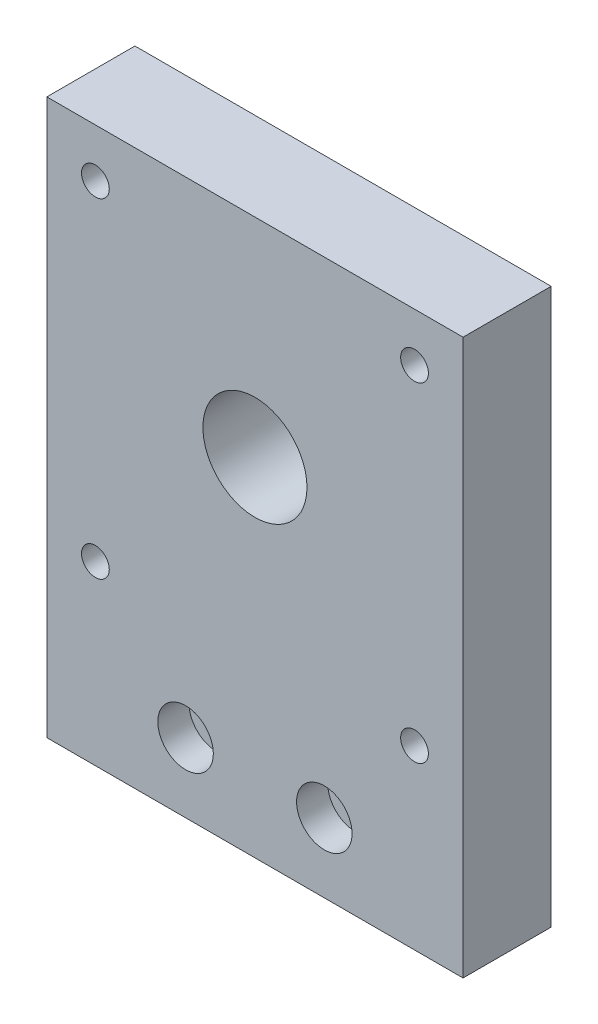
ISO-10303-21;
HEADER;
FILE_DESCRIPTION(('STEP AP214'),'2;1');
FILE_NAME('part.step','',(''),(''),'','','');
FILE_SCHEMA(('AUTOMOTIVE_DESIGN { 1 0 10303 214 1 1 1 1 }'));
ENDSEC;
DATA;
#1=APPLICATION_CONTEXT('core data for automotive mechanical design processes');
#2=APPLICATION_PROTOCOL_DEFINITION('international standard','automotive_design',2000,#1);
#3=PRODUCT_CONTEXT('',#1,'mechanical');
#4=PRODUCT('Part','Part','',(#3));
#5=PRODUCT_RELATED_PRODUCT_CATEGORY('part','',(#4));
#6=PRODUCT_DEFINITION_FORMATION('','',#4);
#7=PRODUCT_DEFINITION_CONTEXT('part definition',#1,'design');
#8=PRODUCT_DEFINITION('design','',#6,#7);
#9=PRODUCT_DEFINITION_SHAPE('','',#8);
#10=(LENGTH_UNIT() NAMED_UNIT(*) SI_UNIT(.MILLI.,.METRE.));
#11=(NAMED_UNIT(*) PLANE_ANGLE_UNIT() SI_UNIT($,.RADIAN.));
#12=(NAMED_UNIT(*) SI_UNIT($,.STERADIAN.) SOLID_ANGLE_UNIT());
#13=UNCERTAINTY_MEASURE_WITH_UNIT(LENGTH_MEASURE(1.E-05),#10,'distance_accuracy_value','');
#14=(GEOMETRIC_REPRESENTATION_CONTEXT(3) GLOBAL_UNCERTAINTY_ASSIGNED_CONTEXT((#13)) GLOBAL_UNIT_ASSIGNED_CONTEXT((#10,
#11,#12)) REPRESENTATION_CONTEXT('',''));
#15=CARTESIAN_POINT('',(0.,0.,0.));
#16=DIRECTION('',(0.,0.,1.));
#17=DIRECTION('',(1.,0.,0.));
#18=AXIS2_PLACEMENT_3D('',#15,#16,#17);
#19=CARTESIAN_POINT('',(10.,-30.,12.7));
#20=DIRECTION('',(0.,0.,-1.));
#21=DIRECTION('',(-1.,0.,0.));
#22=AXIS2_PLACEMENT_3D('',#19,#20,#21);
#23=CYLINDRICAL_SURFACE('',#22,2.);
#24=CARTESIAN_POINT('',(10.,-30.,0.));
#25=DIRECTION('',(0.,0.,1.));
#26=DIRECTION('',(1.,0.,0.));
#27=AXIS2_PLACEMENT_3D('',#24,#25,#26);
#28=CIRCLE('',#27,2.);
#29=CARTESIAN_POINT('',(12.,-30.,0.));
#30=VERTEX_POINT('',#29);
#31=EDGE_CURVE('E139',#30,#30,#28,.T.);
#32=ORIENTED_EDGE('',*,*,#31,.F.);
#33=EDGE_LOOP('',(#32));
#34=FACE_BOUND('',#33,.T.);
#35=CARTESIAN_POINT('',(10.,-30.,8.2));
#36=DIRECTION('',(0.,0.,1.));
#37=DIRECTION('',(1.,0.,0.));
#38=AXIS2_PLACEMENT_3D('',#35,#36,#37);
#39=CIRCLE('',#38,2.);
#40=CARTESIAN_POINT('',(12.,-30.,8.2));
#41=VERTEX_POINT('',#40);
#42=EDGE_CURVE('E39',#41,#41,#39,.T.);
#43=ORIENTED_EDGE('',*,*,#42,.T.);
#44=EDGE_LOOP('',(#43));
#45=FACE_BOUND('',#44,.T.);
#46=ADVANCED_FACE('F35',(#34,#45),#23,.F.);
#47=CARTESIAN_POINT('',(-9.99999999999999,-30.,12.7));
#48=DIRECTION('',(0.,0.,-1.));
#49=DIRECTION('',(-1.,0.,0.));
#50=AXIS2_PLACEMENT_3D('',#47,#48,#49);
#51=CYLINDRICAL_SURFACE('',#50,2.);
#52=CARTESIAN_POINT('',(-9.99999999999999,-30.,0.));
#53=DIRECTION('',(0.,0.,1.));
#54=DIRECTION('',(1.,0.,0.));
#55=AXIS2_PLACEMENT_3D('',#52,#53,#54);
#56=CIRCLE('',#55,2.);
#57=CARTESIAN_POINT('',(-7.99999999999999,-30.,0.));
#58=VERTEX_POINT('',#57);
#59=EDGE_CURVE('E136',#58,#58,#56,.T.);
#60=ORIENTED_EDGE('',*,*,#59,.F.);
#61=EDGE_LOOP('',(#60));
#62=FACE_BOUND('',#61,.T.);
#63=CARTESIAN_POINT('',(-9.99999999999999,-30.,8.2));
#64=DIRECTION('',(0.,0.,1.));
#65=DIRECTION('',(1.,0.,0.));
#66=AXIS2_PLACEMENT_3D('',#63,#64,#65);
#67=CIRCLE('',#66,2.);
#68=CARTESIAN_POINT('',(-7.99999999999999,-30.,8.2));
#69=VERTEX_POINT('',#68);
#70=EDGE_CURVE('E122',#69,#69,#67,.T.);
#71=ORIENTED_EDGE('',*,*,#70,.T.);
#72=EDGE_LOOP('',(#71));
#73=FACE_BOUND('',#72,.T.);
#74=ADVANCED_FACE('F181',(#62,#73),#51,.F.);
#75=CARTESIAN_POINT('',(0.,-40.,12.7));
#76=DIRECTION('',(0.,-1.,0.));
#77=DIRECTION('',(0.,0.,-1.));
#78=AXIS2_PLACEMENT_3D('',#75,#76,#77);
#79=PLANE('',#78);
#80=DIRECTION('',(-1.,0.,0.));
#81=VECTOR('',#80,1.);
#82=CARTESIAN_POINT('',(0.,-40.,0.));
#83=LINE('',#82,#81);
#84=CARTESIAN_POINT('',(30.,-40.,0.));
#85=VERTEX_POINT('',#84);
#86=CARTESIAN_POINT('',(-30.,-40.,0.));
#87=VERTEX_POINT('',#86);
#88=EDGE_CURVE('E119',#85,#87,#83,.T.);
#89=ORIENTED_EDGE('',*,*,#88,.F.);
#90=DIRECTION('',(0.,0.,-1.));
#91=VECTOR('',#90,1.);
#92=CARTESIAN_POINT('',(30.,-40.,12.7));
#93=LINE('',#92,#91);
#94=CARTESIAN_POINT('',(30.,-40.,12.7));
#95=VERTEX_POINT('',#94);
#96=EDGE_CURVE('E11',#95,#85,#93,.T.);
#97=ORIENTED_EDGE('',*,*,#96,.F.);
#98=DIRECTION('',(-1.,0.,0.));
#99=VECTOR('',#98,1.);
#100=CARTESIAN_POINT('',(0.,-40.,12.7));
#101=LINE('',#100,#99);
#102=CARTESIAN_POINT('',(-30.,-40.,12.7));
#103=VERTEX_POINT('',#102);
#104=EDGE_CURVE('E97',#95,#103,#101,.T.);
#105=ORIENTED_EDGE('',*,*,#104,.T.);
#106=DIRECTION('',(0.,0.,-1.));
#107=VECTOR('',#106,1.);
#108=CARTESIAN_POINT('',(-30.,-40.,12.7));
#109=LINE('',#108,#107);
#110=EDGE_CURVE('E76',#103,#87,#109,.T.);
#111=ORIENTED_EDGE('',*,*,#110,.T.);
#112=EDGE_LOOP('',(#89,#97,#105,#111));
#113=FACE_BOUND('',#112,.T.);
#114=ADVANCED_FACE('F37',(#113),#79,.T.);
#115=CARTESIAN_POINT('',(30.,0.,12.7));
#116=DIRECTION('',(1.,0.,0.));
#117=DIRECTION('',(0.,1.,0.));
#118=AXIS2_PLACEMENT_3D('',#115,#116,#117);
#119=PLANE('',#118);
#120=DIRECTION('',(0.,-1.,0.));
#121=VECTOR('',#120,1.);
#122=CARTESIAN_POINT('',(30.,0.,0.));
#123=LINE('',#122,#121);
#124=CARTESIAN_POINT('',(30.,40.,0.));
#125=VERTEX_POINT('',#124);
#126=EDGE_CURVE('E89',#125,#85,#123,.T.);
#127=ORIENTED_EDGE('',*,*,#126,.F.);
#128=DIRECTION('',(0.,0.,-1.));
#129=VECTOR('',#128,1.);
#130=CARTESIAN_POINT('',(30.,40.,12.7));
#131=LINE('',#130,#129);
#132=CARTESIAN_POINT('',(30.,40.,12.7));
#133=VERTEX_POINT('',#132);
#134=EDGE_CURVE('E45',#133,#125,#131,.T.);
#135=ORIENTED_EDGE('',*,*,#134,.F.);
#136=DIRECTION('',(0.,-1.,0.));
#137=VECTOR('',#136,1.);
#138=CARTESIAN_POINT('',(30.,0.,12.7));
#139=LINE('',#138,#137);
#140=EDGE_CURVE('E87',#133,#95,#139,.T.);
#141=ORIENTED_EDGE('',*,*,#140,.T.);
#142=ORIENTED_EDGE('',*,*,#96,.T.);
#143=EDGE_LOOP('',(#127,#135,#141,#142));
#144=FACE_BOUND('',#143,.T.);
#145=ADVANCED_FACE('F85',(#144),#119,.T.);
#146=CARTESIAN_POINT('',(0.,40.,12.7));
#147=DIRECTION('',(0.,-1.,0.));
#148=DIRECTION('',(0.,0.,-1.));
#149=AXIS2_PLACEMENT_3D('',#146,#147,#148);
#150=PLANE('',#149);
#151=DIRECTION('',(-1.,0.,0.));
#152=VECTOR('',#151,1.);
#153=CARTESIAN_POINT('',(0.,40.,0.));
#154=LINE('',#153,#152);
#155=CARTESIAN_POINT('',(-30.,40.,0.));
#156=VERTEX_POINT('',#155);
#157=EDGE_CURVE('E69',#125,#156,#154,.T.);
#158=ORIENTED_EDGE('',*,*,#157,.T.);
#159=DIRECTION('',(0.,0.,-1.));
#160=VECTOR('',#159,1.);
#161=CARTESIAN_POINT('',(-30.,40.,12.7));
#162=LINE('',#161,#160);
#163=CARTESIAN_POINT('',(-30.,40.,12.7));
#164=VERTEX_POINT('',#163);
#165=EDGE_CURVE('E90',#164,#156,#162,.T.);
#166=ORIENTED_EDGE('',*,*,#165,.F.);
#167=DIRECTION('',(-1.,0.,0.));
#168=VECTOR('',#167,1.);
#169=CARTESIAN_POINT('',(0.,40.,12.7));
#170=LINE('',#169,#168);
#171=EDGE_CURVE('E92',#133,#164,#170,.T.);
#172=ORIENTED_EDGE('',*,*,#171,.F.);
#173=ORIENTED_EDGE('',*,*,#134,.T.);
#174=EDGE_LOOP('',(#158,#166,#172,#173));
#175=FACE_BOUND('',#174,.T.);
#176=ADVANCED_FACE('F93',(#175),#150,.F.);
#177=CARTESIAN_POINT('',(0.,10.,12.7));
#178=DIRECTION('',(0.,0.,-1.));
#179=DIRECTION('',(-1.,0.,0.));
#180=AXIS2_PLACEMENT_3D('',#177,#178,#179);
#181=CYLINDRICAL_SURFACE('',#180,7.5);
#182=CARTESIAN_POINT('',(0.,10.,12.7));
#183=DIRECTION('',(0.,0.,1.));
#184=DIRECTION('',(1.,0.,0.));
#185=AXIS2_PLACEMENT_3D('',#182,#183,#184);
#186=CIRCLE('',#185,7.5);
#187=CARTESIAN_POINT('',(7.5,10.,12.7));
#188=VERTEX_POINT('',#187);
#189=EDGE_CURVE('E113',#188,#188,#186,.T.);
#190=ORIENTED_EDGE('',*,*,#189,.T.);
#191=EDGE_LOOP('',(#190));
#192=FACE_BOUND('',#191,.T.);
#193=CARTESIAN_POINT('',(0.,10.,0.));
#194=DIRECTION('',(0.,0.,1.));
#195=DIRECTION('',(1.,0.,0.));
#196=AXIS2_PLACEMENT_3D('',#193,#194,#195);
#197=CIRCLE('',#196,7.5);
#198=CARTESIAN_POINT('',(7.5,10.,0.));
#199=VERTEX_POINT('',#198);
#200=EDGE_CURVE('E142',#199,#199,#197,.T.);
#201=ORIENTED_EDGE('',*,*,#200,.F.);
#202=EDGE_LOOP('',(#201));
#203=FACE_BOUND('',#202,.T.);
#204=ADVANCED_FACE('F191',(#192,#203),#181,.F.);
#205=CARTESIAN_POINT('',(-23.,33.,12.7));
#206=DIRECTION('',(0.,0.,-1.));
#207=DIRECTION('',(-1.,0.,0.));
#208=AXIS2_PLACEMENT_3D('',#205,#206,#207);
#209=CYLINDRICAL_SURFACE('',#208,2.);
#210=CARTESIAN_POINT('',(-23.,33.,12.7));
#211=DIRECTION('',(0.,0.,1.));
#212=DIRECTION('',(1.,0.,0.));
#213=AXIS2_PLACEMENT_3D('',#210,#211,#212);
#214=CIRCLE('',#213,2.);
#215=CARTESIAN_POINT('',(-21.,33.,12.7));
#216=VERTEX_POINT('',#215);
#217=EDGE_CURVE('E110',#216,#216,#214,.T.);
#218=ORIENTED_EDGE('',*,*,#217,.T.);
#219=EDGE_LOOP('',(#218));
#220=FACE_BOUND('',#219,.T.);
#221=CARTESIAN_POINT('',(-23.,33.,0.));
#222=DIRECTION('',(0.,0.,1.));
#223=DIRECTION('',(1.,0.,0.));
#224=AXIS2_PLACEMENT_3D('',#221,#222,#223);
#225=CIRCLE('',#224,2.);
#226=CARTESIAN_POINT('',(-21.,33.,0.));
#227=VERTEX_POINT('',#226);
#228=EDGE_CURVE('E133',#227,#227,#225,.T.);
#229=ORIENTED_EDGE('',*,*,#228,.F.);
#230=EDGE_LOOP('',(#229));
#231=FACE_BOUND('',#230,.T.);
#232=ADVANCED_FACE('F194',(#220,#231),#209,.F.);
#233=CARTESIAN_POINT('',(-23.,-14.5,12.7));
#234=DIRECTION('',(0.,0.,-1.));
#235=DIRECTION('',(-1.,0.,0.));
#236=AXIS2_PLACEMENT_3D('',#233,#234,#235);
#237=CYLINDRICAL_SURFACE('',#236,2.);
#238=CARTESIAN_POINT('',(-23.,-14.5,12.7));
#239=DIRECTION('',(0.,0.,1.));
#240=DIRECTION('',(1.,0.,0.));
#241=AXIS2_PLACEMENT_3D('',#238,#239,#240);
#242=CIRCLE('',#241,2.);
#243=CARTESIAN_POINT('',(-21.,-14.5,12.7));
#244=VERTEX_POINT('',#243);
#245=EDGE_CURVE('E107',#244,#244,#242,.T.);
#246=ORIENTED_EDGE('',*,*,#245,.T.);
#247=EDGE_LOOP('',(#246));
#248=FACE_BOUND('',#247,.T.);
#249=CARTESIAN_POINT('',(-23.,-14.5,0.));
#250=DIRECTION('',(0.,0.,1.));
#251=DIRECTION('',(1.,0.,0.));
#252=AXIS2_PLACEMENT_3D('',#249,#250,#251);
#253=CIRCLE('',#252,2.);
#254=CARTESIAN_POINT('',(-21.,-14.5,0.));
#255=VERTEX_POINT('',#254);
#256=EDGE_CURVE('E130',#255,#255,#253,.T.);
#257=ORIENTED_EDGE('',*,*,#256,.F.);
#258=EDGE_LOOP('',(#257));
#259=FACE_BOUND('',#258,.T.);
#260=ADVANCED_FACE('F197',(#248,#259),#237,.F.);
#261=CARTESIAN_POINT('',(23.,-14.5,12.7));
#262=DIRECTION('',(0.,0.,-1.));
#263=DIRECTION('',(-1.,0.,0.));
#264=AXIS2_PLACEMENT_3D('',#261,#262,#263);
#265=CYLINDRICAL_SURFACE('',#264,2.);
#266=CARTESIAN_POINT('',(23.,-14.5,12.7));
#267=DIRECTION('',(0.,0.,1.));
#268=DIRECTION('',(1.,0.,0.));
#269=AXIS2_PLACEMENT_3D('',#266,#267,#268);
#270=CIRCLE('',#269,2.);
#271=CARTESIAN_POINT('',(25.,-14.5,12.7));
#272=VERTEX_POINT('',#271);
#273=EDGE_CURVE('E104',#272,#272,#270,.F.);
#274=ORIENTED_EDGE('',*,*,#273,.F.);
#275=EDGE_LOOP('',(#274));
#276=FACE_BOUND('',#275,.T.);
#277=CARTESIAN_POINT('',(23.,-14.5,0.));
#278=DIRECTION('',(0.,0.,1.));
#279=DIRECTION('',(1.,0.,0.));
#280=AXIS2_PLACEMENT_3D('',#277,#278,#279);
#281=CIRCLE('',#280,2.);
#282=CARTESIAN_POINT('',(25.,-14.5,0.));
#283=VERTEX_POINT('',#282);
#284=EDGE_CURVE('E127',#283,#283,#281,.F.);
#285=ORIENTED_EDGE('',*,*,#284,.T.);
#286=EDGE_LOOP('',(#285));
#287=FACE_BOUND('',#286,.T.);
#288=ADVANCED_FACE('F201',(#276,#287),#265,.F.);
#289=CARTESIAN_POINT('',(-30.,0.,12.7));
#290=DIRECTION('',(1.,0.,0.));
#291=DIRECTION('',(0.,1.,0.));
#292=AXIS2_PLACEMENT_3D('',#289,#290,#291);
#293=PLANE('',#292);
#294=DIRECTION('',(0.,-1.,0.));
#295=VECTOR('',#294,1.);
#296=CARTESIAN_POINT('',(-30.,0.,0.));
#297=LINE('',#296,#295);
#298=EDGE_CURVE('E125',#156,#87,#297,.T.);
#299=ORIENTED_EDGE('',*,*,#298,.T.);
#300=ORIENTED_EDGE('',*,*,#110,.F.);
#301=DIRECTION('',(0.,-1.,0.));
#302=VECTOR('',#301,1.);
#303=CARTESIAN_POINT('',(-30.,0.,12.7));
#304=LINE('',#303,#302);
#305=EDGE_CURVE('E54',#164,#103,#304,.T.);
#306=ORIENTED_EDGE('',*,*,#305,.F.);
#307=ORIENTED_EDGE('',*,*,#165,.T.);
#308=EDGE_LOOP('',(#299,#300,#306,#307));
#309=FACE_BOUND('',#308,.T.);
#310=ADVANCED_FACE('F205',(#309),#293,.F.);
#311=CARTESIAN_POINT('',(23.,33.,12.7));
#312=DIRECTION('',(0.,0.,-1.));
#313=DIRECTION('',(-1.,0.,0.));
#314=AXIS2_PLACEMENT_3D('',#311,#312,#313);
#315=CYLINDRICAL_SURFACE('',#314,2.);
#316=CARTESIAN_POINT('',(23.,33.,12.7));
#317=DIRECTION('',(0.,0.,1.));
#318=DIRECTION('',(1.,0.,0.));
#319=AXIS2_PLACEMENT_3D('',#316,#317,#318);
#320=CIRCLE('',#319,2.);
#321=CARTESIAN_POINT('',(25.,33.,12.7));
#322=VERTEX_POINT('',#321);
#323=EDGE_CURVE('E116',#322,#322,#320,.F.);
#324=ORIENTED_EDGE('',*,*,#323,.F.);
#325=EDGE_LOOP('',(#324));
#326=FACE_BOUND('',#325,.T.);
#327=CARTESIAN_POINT('',(23.,33.,0.));
#328=DIRECTION('',(0.,0.,1.));
#329=DIRECTION('',(1.,0.,0.));
#330=AXIS2_PLACEMENT_3D('',#327,#328,#329);
#331=CIRCLE('',#330,2.);
#332=CARTESIAN_POINT('',(25.,33.,0.));
#333=VERTEX_POINT('',#332);
#334=EDGE_CURVE('E99',#333,#333,#331,.F.);
#335=ORIENTED_EDGE('',*,*,#334,.T.);
#336=EDGE_LOOP('',(#335));
#337=FACE_BOUND('',#336,.T.);
#338=ADVANCED_FACE('F209',(#326,#337),#315,.F.);
#339=CARTESIAN_POINT('',(0.,0.,12.7));
#340=DIRECTION('',(0.,0.,1.));
#341=DIRECTION('',(1.,0.,0.));
#342=AXIS2_PLACEMENT_3D('',#339,#340,#341);
#343=PLANE('',#342);
#344=CARTESIAN_POINT('',(10.,-30.,12.7));
#345=DIRECTION('',(0.,0.,1.));
#346=DIRECTION('',(1.,0.,0.));
#347=AXIS2_PLACEMENT_3D('',#344,#345,#346);
#348=CIRCLE('',#347,4.);
#349=CARTESIAN_POINT('',(14.,-30.,12.7));
#350=VERTEX_POINT('',#349);
#351=EDGE_CURVE('E159',#350,#350,#348,.T.);
#352=ORIENTED_EDGE('',*,*,#351,.F.);
#353=EDGE_LOOP('',(#352));
#354=FACE_BOUND('',#353,.T.);
#355=CARTESIAN_POINT('',(-9.99999999999999,-30.,12.7));
#356=DIRECTION('',(0.,0.,1.));
#357=DIRECTION('',(1.,0.,0.));
#358=AXIS2_PLACEMENT_3D('',#355,#356,#357);
#359=CIRCLE('',#358,4.);
#360=CARTESIAN_POINT('',(-5.99999999999999,-30.,12.7));
#361=VERTEX_POINT('',#360);
#362=EDGE_CURVE('E153',#361,#361,#359,.T.);
#363=ORIENTED_EDGE('',*,*,#362,.F.);
#364=EDGE_LOOP('',(#363));
#365=FACE_BOUND('',#364,.T.);
#366=ORIENTED_EDGE('',*,*,#104,.F.);
#367=ORIENTED_EDGE('',*,*,#140,.F.);
#368=ORIENTED_EDGE('',*,*,#171,.T.);
#369=ORIENTED_EDGE('',*,*,#305,.T.);
#370=EDGE_LOOP('',(#366,#367,#368,#369));
#371=FACE_BOUND('',#370,.T.);
#372=ORIENTED_EDGE('',*,*,#273,.T.);
#373=EDGE_LOOP('',(#372));
#374=FACE_BOUND('',#373,.T.);
#375=ORIENTED_EDGE('',*,*,#245,.F.);
#376=EDGE_LOOP('',(#375));
#377=FACE_BOUND('',#376,.T.);
#378=ORIENTED_EDGE('',*,*,#217,.F.);
#379=EDGE_LOOP('',(#378));
#380=FACE_BOUND('',#379,.T.);
#381=ORIENTED_EDGE('',*,*,#189,.F.);
#382=EDGE_LOOP('',(#381));
#383=FACE_BOUND('',#382,.T.);
#384=ORIENTED_EDGE('',*,*,#323,.T.);
#385=EDGE_LOOP('',(#384));
#386=FACE_BOUND('',#385,.T.);
#387=ADVANCED_FACE('F95',(#354,#365,#371,#374,#377,#380,#383,#386),#343,.T.);
#388=CARTESIAN_POINT('',(0.,0.,0.));
#389=DIRECTION('',(0.,0.,1.));
#390=DIRECTION('',(1.,0.,0.));
#391=AXIS2_PLACEMENT_3D('',#388,#389,#390);
#392=PLANE('',#391);
#393=ORIENTED_EDGE('',*,*,#88,.T.);
#394=ORIENTED_EDGE('',*,*,#298,.F.);
#395=ORIENTED_EDGE('',*,*,#157,.F.);
#396=ORIENTED_EDGE('',*,*,#126,.T.);
#397=EDGE_LOOP('',(#393,#394,#395,#396));
#398=FACE_BOUND('',#397,.T.);
#399=ORIENTED_EDGE('',*,*,#284,.F.);
#400=EDGE_LOOP('',(#399));
#401=FACE_BOUND('',#400,.T.);
#402=ORIENTED_EDGE('',*,*,#256,.T.);
#403=EDGE_LOOP('',(#402));
#404=FACE_BOUND('',#403,.T.);
#405=ORIENTED_EDGE('',*,*,#228,.T.);
#406=EDGE_LOOP('',(#405));
#407=FACE_BOUND('',#406,.T.);
#408=ORIENTED_EDGE('',*,*,#59,.T.);
#409=EDGE_LOOP('',(#408));
#410=FACE_BOUND('',#409,.T.);
#411=ORIENTED_EDGE('',*,*,#31,.T.);
#412=EDGE_LOOP('',(#411));
#413=FACE_BOUND('',#412,.T.);
#414=ORIENTED_EDGE('',*,*,#200,.T.);
#415=EDGE_LOOP('',(#414));
#416=FACE_BOUND('',#415,.T.);
#417=ORIENTED_EDGE('',*,*,#334,.F.);
#418=EDGE_LOOP('',(#417));
#419=FACE_BOUND('',#418,.T.);
#420=ADVANCED_FACE('F220',(#398,#401,#404,#407,#410,#413,#416,#419),#392,.F.);
#421=CARTESIAN_POINT('',(-9.99999999999999,-30.,8.2));
#422=DIRECTION('',(0.,0.,1.));
#423=DIRECTION('',(1.,0.,0.));
#424=AXIS2_PLACEMENT_3D('',#421,#422,#423);
#425=CYLINDRICAL_SURFACE('',#424,4.);
#426=CARTESIAN_POINT('',(-9.99999999999999,-30.,8.2));
#427=DIRECTION('',(0.,0.,1.));
#428=DIRECTION('',(1.,0.,0.));
#429=AXIS2_PLACEMENT_3D('',#426,#427,#428);
#430=CIRCLE('',#429,4.);
#431=CARTESIAN_POINT('',(-5.99999999999999,-30.,8.2));
#432=VERTEX_POINT('',#431);
#433=EDGE_CURVE('E149',#432,#432,#430,.T.);
#434=ORIENTED_EDGE('',*,*,#433,.F.);
#435=EDGE_LOOP('',(#434));
#436=FACE_BOUND('',#435,.T.);
#437=ORIENTED_EDGE('',*,*,#362,.T.);
#438=EDGE_LOOP('',(#437));
#439=FACE_BOUND('',#438,.T.);
#440=ADVANCED_FACE('F223',(#436,#439),#425,.F.);
#441=CARTESIAN_POINT('',(-9.99999999999999,-30.,8.2));
#442=DIRECTION('',(0.,0.,1.));
#443=DIRECTION('',(1.,0.,0.));
#444=AXIS2_PLACEMENT_3D('',#441,#442,#443);
#445=PLANE('',#444);
#446=ORIENTED_EDGE('',*,*,#70,.F.);
#447=EDGE_LOOP('',(#446));
#448=FACE_BOUND('',#447,.T.);
#449=ORIENTED_EDGE('',*,*,#433,.T.);
#450=EDGE_LOOP('',(#449));
#451=FACE_BOUND('',#450,.T.);
#452=ADVANCED_FACE('F177',(#448,#451),#445,.T.);
#453=CARTESIAN_POINT('',(10.,-30.,8.2));
#454=DIRECTION('',(0.,0.,1.));
#455=DIRECTION('',(1.,0.,0.));
#456=AXIS2_PLACEMENT_3D('',#453,#454,#455);
#457=CYLINDRICAL_SURFACE('',#456,4.);
#458=CARTESIAN_POINT('',(10.,-30.,8.2));
#459=DIRECTION('',(0.,0.,1.));
#460=DIRECTION('',(1.,0.,0.));
#461=AXIS2_PLACEMENT_3D('',#458,#459,#460);
#462=CIRCLE('',#461,4.);
#463=CARTESIAN_POINT('',(14.,-30.,8.2));
#464=VERTEX_POINT('',#463);
#465=EDGE_CURVE('E162',#464,#464,#462,.T.);
#466=ORIENTED_EDGE('',*,*,#465,.F.);
#467=EDGE_LOOP('',(#466));
#468=FACE_BOUND('',#467,.T.);
#469=ORIENTED_EDGE('',*,*,#351,.T.);
#470=EDGE_LOOP('',(#469));
#471=FACE_BOUND('',#470,.T.);
#472=ADVANCED_FACE('F172',(#468,#471),#457,.F.);
#473=CARTESIAN_POINT('',(10.,-30.,8.2));
#474=DIRECTION('',(0.,0.,1.));
#475=DIRECTION('',(1.,0.,0.));
#476=AXIS2_PLACEMENT_3D('',#473,#474,#475);
#477=PLANE('',#476);
#478=ORIENTED_EDGE('',*,*,#42,.F.);
#479=EDGE_LOOP('',(#478));
#480=FACE_BOUND('',#479,.T.);
#481=ORIENTED_EDGE('',*,*,#465,.T.);
#482=EDGE_LOOP('',(#481));
#483=FACE_BOUND('',#482,.T.);
#484=ADVANCED_FACE('F170',(#480,#483),#477,.T.);
#485=CLOSED_SHELL('',(#46,#74,#114,#145,#176,#204,#232,#260,#288,#310,#338,#387,#420,#440,#452,
#472,#484));
#486=MANIFOLD_SOLID_BREP('B2',#485);
#487=ADVANCED_BREP_SHAPE_REPRESENTATION('',(#18,#486),#14);
#488=SHAPE_DEFINITION_REPRESENTATION(#9,#487);
ENDSEC;
END-ISO-10303-21;
